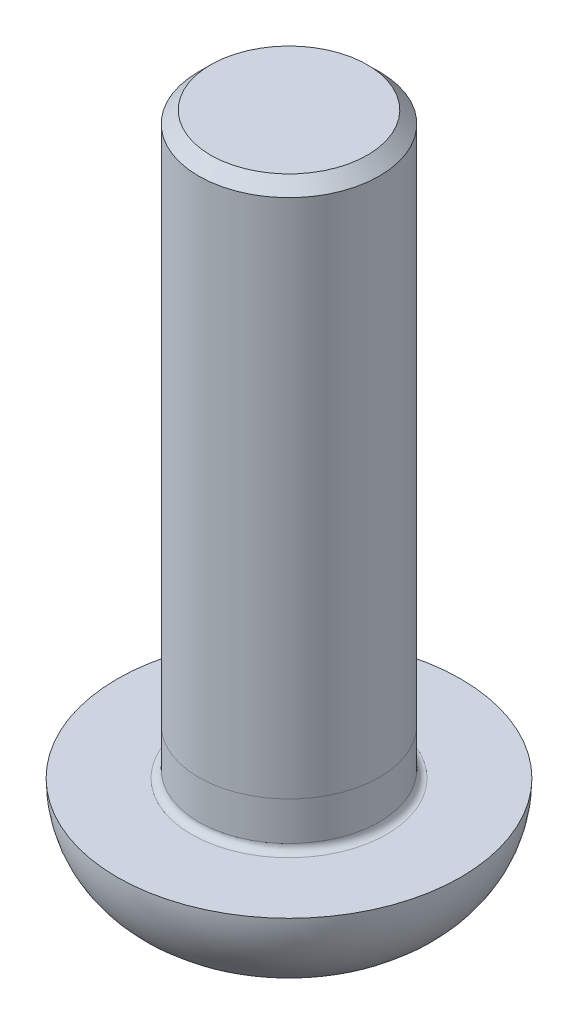
ISO-10303-21;
HEADER;
FILE_DESCRIPTION(('STEP AP214'),'2;1');
FILE_NAME('part.step','',(''),(''),'','','');
FILE_SCHEMA(('AUTOMOTIVE_DESIGN { 1 0 10303 214 1 1 1 1 }'));
ENDSEC;
DATA;
#1=APPLICATION_CONTEXT('core data for automotive mechanical design processes');
#2=APPLICATION_PROTOCOL_DEFINITION('international standard','automotive_design',2000,#1);
#3=PRODUCT_CONTEXT('',#1,'mechanical');
#4=PRODUCT('Part','Part','',(#3));
#5=PRODUCT_RELATED_PRODUCT_CATEGORY('part','',(#4));
#6=PRODUCT_DEFINITION_FORMATION('','',#4);
#7=PRODUCT_DEFINITION_CONTEXT('part definition',#1,'design');
#8=PRODUCT_DEFINITION('design','',#6,#7);
#9=PRODUCT_DEFINITION_SHAPE('','',#8);
#10=(LENGTH_UNIT() NAMED_UNIT(*) SI_UNIT(.MILLI.,.METRE.));
#11=(NAMED_UNIT(*) PLANE_ANGLE_UNIT() SI_UNIT($,.RADIAN.));
#12=(NAMED_UNIT(*) SI_UNIT($,.STERADIAN.) SOLID_ANGLE_UNIT());
#13=UNCERTAINTY_MEASURE_WITH_UNIT(LENGTH_MEASURE(1.E-05),#10,'distance_accuracy_value','');
#14=(GEOMETRIC_REPRESENTATION_CONTEXT(3) GLOBAL_UNCERTAINTY_ASSIGNED_CONTEXT((#13)) GLOBAL_UNIT_ASSIGNED_CONTEXT((#10,
#11,#12)) REPRESENTATION_CONTEXT('',''));
#15=CARTESIAN_POINT('',(0.,0.,0.));
#16=DIRECTION('',(0.,0.,1.));
#17=DIRECTION('',(1.,0.,0.));
#18=AXIS2_PLACEMENT_3D('',#15,#16,#17);
#19=CARTESIAN_POINT('',(0.,0.,0.));
#20=DIRECTION('',(0.,1.,0.));
#21=DIRECTION('',(0.,0.,1.));
#22=AXIS2_PLACEMENT_3D('',#19,#20,#21);
#23=CYLINDRICAL_SURFACE('',#22,2.5);
#24=CARTESIAN_POINT('',(0.,15.6666666666666,0.));
#25=DIRECTION('',(0.,1.,0.));
#26=DIRECTION('',(0.,0.,1.));
#27=AXIS2_PLACEMENT_3D('',#24,#25,#26);
#28=CIRCLE('',#27,2.5);
#29=CARTESIAN_POINT('',(0.,15.6666666666666,2.5));
#30=VERTEX_POINT('',#29);
#31=EDGE_CURVE('E28',#30,#30,#28,.F.);
#32=ORIENTED_EDGE('',*,*,#31,.T.);
#33=EDGE_LOOP('',(#32));
#34=FACE_BOUND('',#33,.T.);
#35=CARTESIAN_POINT('',(0.,1.26666666666666,0.));
#36=DIRECTION('',(0.,1.,0.));
#37=DIRECTION('',(0.,0.,1.));
#38=AXIS2_PLACEMENT_3D('',#35,#36,#37);
#39=CIRCLE('',#38,2.5);
#40=CARTESIAN_POINT('',(0.,1.26666666666666,2.5));
#41=VERTEX_POINT('',#40);
#42=EDGE_CURVE('E11',#41,#41,#39,.T.);
#43=ORIENTED_EDGE('',*,*,#42,.T.);
#44=EDGE_LOOP('',(#43));
#45=FACE_BOUND('',#44,.T.);
#46=ADVANCED_FACE('F18',(#34,#45),#23,.T.);
#47=ORIENTED_EDGE('',*,*,#42,.F.);
#48=EDGE_LOOP('',(#47));
#49=FACE_BOUND('',#48,.T.);
#50=CARTESIAN_POINT('',(0.,0.2,0.));
#51=DIRECTION('',(0.,1.,0.));
#52=DIRECTION('',(0.,0.,1.));
#53=AXIS2_PLACEMENT_3D('',#50,#51,#52);
#54=CIRCLE('',#53,2.5);
#55=CARTESIAN_POINT('',(0.,0.2,2.5));
#56=VERTEX_POINT('',#55);
#57=EDGE_CURVE('E280',#56,#56,#54,.T.);
#58=ORIENTED_EDGE('',*,*,#57,.T.);
#59=EDGE_LOOP('',(#58));
#60=FACE_BOUND('',#59,.T.);
#61=ADVANCED_FACE('F192',(#49,#60),#23,.T.);
#62=CARTESIAN_POINT('',(4.75,0.,0.));
#63=DIRECTION('',(0.,1.,0.));
#64=DIRECTION('',(0.,0.,1.));
#65=AXIS2_PLACEMENT_3D('',#62,#63,#64);
#66=PLANE('',#65);
#67=CARTESIAN_POINT('',(0.,0.,0.));
#68=DIRECTION('',(0.,1.,0.));
#69=DIRECTION('',(0.,0.,1.));
#70=AXIS2_PLACEMENT_3D('',#67,#68,#69);
#71=CIRCLE('',#70,2.7);
#72=CARTESIAN_POINT('',(0.,0.,2.7));
#73=VERTEX_POINT('',#72);
#74=EDGE_CURVE('E277',#73,#73,#71,.F.);
#75=ORIENTED_EDGE('',*,*,#74,.T.);
#76=EDGE_LOOP('',(#75));
#77=FACE_BOUND('',#76,.T.);
#78=CARTESIAN_POINT('',(0.,0.,0.));
#79=DIRECTION('',(0.,1.,0.));
#80=DIRECTION('',(0.,0.,1.));
#81=AXIS2_PLACEMENT_3D('',#78,#79,#80);
#82=CIRCLE('',#81,4.75);
#83=CARTESIAN_POINT('',(0.,0.,4.75));
#84=VERTEX_POINT('',#83);
#85=EDGE_CURVE('E108',#84,#84,#82,.T.);
#86=ORIENTED_EDGE('',*,*,#85,.T.);
#87=EDGE_LOOP('',(#86));
#88=FACE_BOUND('',#87,.T.);
#89=ADVANCED_FACE('F199',(#77,#88),#66,.T.);
#90=CARTESIAN_POINT('',(0.,16.,0.));
#91=DIRECTION('',(0.,1.,0.));
#92=DIRECTION('',(0.,0.,1.));
#93=AXIS2_PLACEMENT_3D('',#90,#91,#92);
#94=PLANE('',#93);
#95=CARTESIAN_POINT('',(0.,16.,0.));
#96=DIRECTION('',(0.,1.,0.));
#97=DIRECTION('',(0.,0.,1.));
#98=AXIS2_PLACEMENT_3D('',#95,#96,#97);
#99=CIRCLE('',#98,2.16666666666667);
#100=CARTESIAN_POINT('',(0.,16.,2.16666666666667));
#101=VERTEX_POINT('',#100);
#102=EDGE_CURVE('E282',#101,#101,#99,.T.);
#103=ORIENTED_EDGE('',*,*,#102,.T.);
#104=EDGE_LOOP('',(#103));
#105=FACE_BOUND('',#104,.T.);
#106=ADVANCED_FACE('F227',(#105),#94,.T.);
#107=CARTESIAN_POINT('',(0.,0.2,0.));
#108=DIRECTION('',(0.,1.,0.));
#109=DIRECTION('',(0.,0.,1.));
#110=AXIS2_PLACEMENT_3D('',#107,#108,#109);
#111=TOROIDAL_SURFACE('',#110,2.7,0.2);
#112=ORIENTED_EDGE('',*,*,#74,.F.);
#113=EDGE_LOOP('',(#112));
#114=FACE_BOUND('',#113,.T.);
#115=ORIENTED_EDGE('',*,*,#57,.F.);
#116=EDGE_LOOP('',(#115));
#117=FACE_BOUND('',#116,.T.);
#118=ADVANCED_FACE('F265',(#114,#117),#111,.F.);
#119=CARTESIAN_POINT('',(0.,16.,0.));
#120=DIRECTION('',(0.,-1.,0.));
#121=DIRECTION('',(0.,0.,-1.));
#122=AXIS2_PLACEMENT_3D('',#119,#120,#121);
#123=CONICAL_SURFACE('',#122,2.16666666666667,0.785398163397446);
#124=ORIENTED_EDGE('',*,*,#31,.F.);
#125=EDGE_LOOP('',(#124));
#126=FACE_BOUND('',#125,.T.);
#127=ORIENTED_EDGE('',*,*,#102,.F.);
#128=EDGE_LOOP('',(#127));
#129=FACE_BOUND('',#128,.T.);
#130=ADVANCED_FACE('F21',(#126,#129),#123,.T.);
#131=CARTESIAN_POINT('',(0.,0.,0.));
#132=DIRECTION('',(0.,-1.,0.));
#133=DIRECTION('',(0.,0.,-1.));
#134=AXIS2_PLACEMENT_3D('',#131,#132,#133);
#135=DEGENERATE_TOROIDAL_SURFACE('',#134,1.98223347818215,2.76776652181785,.T.);
#136=ORIENTED_EDGE('',*,*,#85,.F.);
#137=EDGE_LOOP('',(#136));
#138=FACE_BOUND('',#137,.T.);
#139=CARTESIAN_POINT('',(0.,-2.75,0.));
#140=DIRECTION('',(0.,-1.,0.));
#141=DIRECTION('',(0.,0.,-1.));
#142=AXIS2_PLACEMENT_3D('',#139,#140,#141);
#143=CIRCLE('',#142,2.29533333333334);
#144=CARTESIAN_POINT('',(0.,-2.75,-2.29533333333334));
#145=VERTEX_POINT('',#144);
#146=EDGE_CURVE('E119',#145,#145,#143,.T.);
#147=ORIENTED_EDGE('',*,*,#146,.F.);
#148=EDGE_LOOP('',(#147));
#149=FACE_BOUND('',#148,.T.);
#150=ADVANCED_FACE('F143',(#138,#149),#135,.T.);
#151=CARTESIAN_POINT('',(0.,0.0925836230047557,0.));
#152=DIRECTION('',(0.,-1.,0.));
#153=DIRECTION('',(0.,0.,-1.));
#154=AXIS2_PLACEMENT_3D('',#151,#152,#153);
#155=CONICAL_SURFACE('',#154,0.,1.0471975511966);
#156=CARTESIAN_POINT('',(0.,0.0925836230047561,0.));
#157=VERTEX_POINT('',#156);
#158=VERTEX_LOOP('',#157);
#159=FACE_BOUND('',#158,.T.);
#160=CARTESIAN_POINT('',(-0.865909933730604,-0.907483050328135,1.5002));
#161=CARTESIAN_POINT('',(-0.903968454193449,-0.885499233548862,1.43428070889745));
#162=CARTESIAN_POINT('',(-0.942355490953076,-0.865505266461506,1.36779241087776));
#163=CARTESIAN_POINT('',(-1.01979436916422,-0.83060447796419,1.23366433933493));
#164=CARTESIAN_POINT('',(-1.05884758728359,-0.815710005102851,1.16602218135311));
#165=CARTESIAN_POINT('',(-1.13646999803242,-0.792523058089927,1.03157622213015));
#166=CARTESIAN_POINT('',(-1.17502724286933,-0.784076288491498,0.96479311507275));
#167=CARTESIAN_POINT('',(-1.25232329150577,-0.773989954291537,0.830912431610116));
#168=CARTESIAN_POINT('',(-1.29106181408334,-0.772342040137576,0.763815342295617));
#169=CARTESIAN_POINT('',(-1.36345580713301,-0.775757999832789,0.638425268170801));
#170=CARTESIAN_POINT('',(-1.39712207785429,-0.779983136003665,0.580113576780177));
#171=CARTESIAN_POINT('',(-1.46423526865157,-0.793378152212355,0.463870120461215));
#172=CARTESIAN_POINT('',(-1.49768195634506,-0.802552614395532,0.405938758031212));
#173=CARTESIAN_POINT('',(-1.56493368410116,-0.825489560734679,0.289455348660847));
#174=CARTESIAN_POINT('',(-1.59873020609217,-0.83934933894113,0.230918055453307));
#175=CARTESIAN_POINT('',(-1.6658189879754,-0.870806161016339,0.11471687661364));
#176=CARTESIAN_POINT('',(-1.699112108342,-0.888395806669299,0.0570515005961896));
#177=CARTESIAN_POINT('',(-1.73216627762271,-0.907483050328134,-0.000199999999999938));
#178=B_SPLINE_CURVE_WITH_KNOTS('',3,(#160,#161,#162,#163,#164,#165,#166,#167,#168,#169,#170,
#171,#172,#173,#174,#175,#176,#177),.UNSPECIFIED.,.F.,.F.,(4,2,2,2,2,2,2,2,4),(0.,
0.237777822177384,0.476127422841921,0.708577067230593,0.940741159251584,1.14294352835891,
1.34533342091876,1.55221450553907,1.75868901573748),.UNSPECIFIED.);
#179=CARTESIAN_POINT('',(-0.866025403784442,-0.907416376995246,1.5));
#180=VERTEX_POINT('',#179);
#181=CARTESIAN_POINT('',(-1.73205080756887,-0.907416376995245,0.));
#182=VERTEX_POINT('',#181);
#183=EDGE_CURVE('E231',#180,#182,#178,.T.);
#184=ORIENTED_EDGE('',*,*,#183,.T.);
#185=CARTESIAN_POINT('',(-1.73216627762271,-0.907483050328134,0.000199999999999923));
#186=CARTESIAN_POINT('',(-1.69410775715987,-0.88549923354886,-0.065719291102547));
#187=CARTESIAN_POINT('',(-1.65572072040024,-0.865505266461504,-0.132207589122234));
#188=CARTESIAN_POINT('',(-1.5782818421891,-0.830604477964188,-0.266335660665069));
#189=CARTESIAN_POINT('',(-1.53922862406973,-0.815710005102848,-0.333977818646885));
#190=CARTESIAN_POINT('',(-1.4616062133209,-0.792523058089924,-0.468423777869842));
#191=CARTESIAN_POINT('',(-1.42304896848399,-0.784076288491495,-0.535206884927247));
#192=CARTESIAN_POINT('',(-1.34575291984755,-0.773989954291535,-0.66908756838988));
#193=CARTESIAN_POINT('',(-1.30701439726998,-0.772342040137574,-0.736184657704378));
#194=CARTESIAN_POINT('',(-1.23462040422031,-0.775757999832787,-0.861574731829195));
#195=CARTESIAN_POINT('',(-1.20095413349903,-0.779983136003662,-0.919886423219819));
#196=CARTESIAN_POINT('',(-1.13384094270174,-0.793378152212352,-1.03612987953878));
#197=CARTESIAN_POINT('',(-1.10039425500826,-0.80255261439553,-1.09406124196879));
#198=CARTESIAN_POINT('',(-1.03314252725215,-0.825489560734676,-1.21054465133915));
#199=CARTESIAN_POINT('',(-0.999346005261149,-0.839349338941127,-1.26908194454669));
#200=CARTESIAN_POINT('',(-0.932257223377915,-0.870806161016338,-1.38528312338636));
#201=CARTESIAN_POINT('',(-0.898964103011319,-0.888395806669298,-1.44294849940381));
#202=CARTESIAN_POINT('',(-0.865909933730599,-0.907483050328135,-1.5002));
#203=B_SPLINE_CURVE_WITH_KNOTS('',3,(#185,#186,#187,#188,#189,#190,#191,#192,#193,#194,#195,
#196,#197,#198,#199,#200,#201,#202),.UNSPECIFIED.,.F.,.F.,(4,2,2,2,2,2,2,2,4),(0.,
0.237777822177384,0.476127422841919,0.70857706723059,0.940741159251581,1.14294352835891,
1.34533342091876,1.55221450553907,1.75868901573748),.UNSPECIFIED.);
#204=CARTESIAN_POINT('',(-0.866025403784436,-0.907416376995246,-1.5));
#205=VERTEX_POINT('',#204);
#206=EDGE_CURVE('E210',#182,#205,#203,.T.);
#207=ORIENTED_EDGE('',*,*,#206,.T.);
#208=CARTESIAN_POINT('',(-3.02145642388414,-1.85499597925637,-1.5));
#209=CARTESIAN_POINT('',(-2.95131363222548,-1.81872634413046,-1.5));
#210=CARTESIAN_POINT('',(-2.88107133565645,-1.78264804643317,-1.5));
#211=CARTESIAN_POINT('',(-2.74034345018755,-1.71096639873344,-1.5));
#212=CARTESIAN_POINT('',(-2.66985785718801,-1.67536305678391,-1.5));
#213=CARTESIAN_POINT('',(-2.45775199033708,-1.56929505571651,-1.5));
#214=CARTESIAN_POINT('',(-2.31570212462528,-1.49968664419272,-1.5));
#215=CARTESIAN_POINT('',(-2.0222700931377,-1.36025010782342,-1.5));
#216=CARTESIAN_POINT('',(-1.87079658899418,-1.29061113184475,-1.5));
#217=CARTESIAN_POINT('',(-1.64154653334164,-1.19092613711938,-1.5));
#218=CARTESIAN_POINT('',(-1.56480867695362,-1.15850064529067,-1.5));
#219=CARTESIAN_POINT('',(-1.41048071876465,-1.09575464897766,-1.5));
#220=CARTESIAN_POINT('',(-1.33289069925537,-1.06543394327289,-1.5));
#221=CARTESIAN_POINT('',(-1.16506923685472,-1.00326385892879,-1.5));
#222=CARTESIAN_POINT('',(-1.07467184506323,-0.971856304712149,-1.5));
#223=CARTESIAN_POINT('',(-0.892286344288553,-0.914121423485026,-1.5));
#224=CARTESIAN_POINT('',(-0.800299039468324,-0.887791605663107,-1.5));
#225=CARTESIAN_POINT('',(-0.616384962739645,-0.842503687233488,-1.5));
#226=CARTESIAN_POINT('',(-0.524492112475494,-0.823411627465088,-1.5));
#227=CARTESIAN_POINT('',(-0.339332787815074,-0.793844811415096,-1.5));
#228=CARTESIAN_POINT('',(-0.246067166383446,-0.783364916483212,-1.5));
#229=CARTESIAN_POINT('',(-0.0575309294622103,-0.772365176381842,-1.5));
#230=CARTESIAN_POINT('',(0.0377489009569059,-0.771995442319628,-1.5));
#231=CARTESIAN_POINT('',(0.227780550171567,-0.781659314746172,-1.5));
#232=CARTESIAN_POINT('',(0.322532205107233,-0.791695986775011,-1.5));
#233=CARTESIAN_POINT('',(0.512543387261529,-0.821037981256058,-1.5));
#234=CARTESIAN_POINT('',(0.60777273050509,-0.840531114897656,-1.5));
#235=CARTESIAN_POINT('',(0.796454627035134,-0.886704530221089,-1.5));
#236=CARTESIAN_POINT('',(0.889906503309468,-0.913387493957522,-1.5));
#237=CARTESIAN_POINT('',(1.07404515505715,-0.971638917632286,-1.5));
#238=CARTESIAN_POINT('',(1.16475145498871,-1.00314689099956,-1.5));
#239=CARTESIAN_POINT('',(1.34480972609266,-1.06984863548089,-1.49999999999999));
#240=CARTESIAN_POINT('',(1.43416131246012,-1.10504343218365,-1.49999999999999));
#241=CARTESIAN_POINT('',(1.61186009121394,-1.17813872958031,-1.5));
#242=CARTESIAN_POINT('',(1.70020602613332,-1.21604226107406,-1.49999999999999));
#243=CARTESIAN_POINT('',(1.87602988508462,-1.29381450595419,-1.49999999999999));
#244=CARTESIAN_POINT('',(1.96350775752119,-1.33368333532212,-1.49999999999999));
#245=CARTESIAN_POINT('',(2.1326218487944,-1.41248972462724,-1.49999999999999));
#246=CARTESIAN_POINT('',(2.21429755819774,-1.45134289392663,-1.49999999999999));
#247=CARTESIAN_POINT('',(2.37716279390999,-1.53006046378019,-1.49999999999999));
#248=CARTESIAN_POINT('',(2.4583523024031,-1.56992490111324,-1.49999999999999));
#249=CARTESIAN_POINT('',(2.62004632732072,-1.6503022330724,-1.49999999999999));
#250=CARTESIAN_POINT('',(2.70055225558183,-1.69081229420091,-1.49999999999999));
#251=CARTESIAN_POINT('',(2.86123337707426,-1.77246576421029,-1.49999999999999));
#252=CARTESIAN_POINT('',(2.94140859951954,-1.81360911555932,-1.49999999999999));
#253=CARTESIAN_POINT('',(3.02145642388415,-1.85499597925637,-1.5));
#254=B_SPLINE_CURVE_WITH_KNOTS('',3,(#208,#209,#210,#211,#212,#213,#214,#215,#216,#217,#218,
#219,#220,#221,#222,#223,#224,#225,#226,#227,#228,#229,#230,#231,#232,#233,#234,#235,#236,#237,
#238,#239,#240,#241,#242,#243,#244,#245,#246,#247,#248,#249,#250,#251,#252,#253),.UNSPECIFIED.,
.F.,.F.,(4,2,2,2,2,2,2,2,2,2,2,2,2,2,2,2,2,2,2,2,2,2,4),(0.,0.236895851279357,0.473795714055903,
0.948337668306544,1.44837680374914,1.69827558933975,1.94815045126331,2.23513816543362,
2.52198474176536,2.80322774532891,3.08430281656004,3.36954893314226,3.6548791019808,
3.94612368672111,4.23747706650592,4.52543887437366,4.81348100032893,5.10185062065299,
5.39023727945614,5.66156699087906,5.93290658449597,6.20327446222167,6.47361792142006),.UNSPECIFIED.);
#255=CARTESIAN_POINT('',(0.866025403784441,-0.907416376995245,-1.5));
#256=VERTEX_POINT('',#255);
#257=EDGE_CURVE('E106',#205,#256,#254,.T.);
#258=ORIENTED_EDGE('',*,*,#257,.T.);
#259=CARTESIAN_POINT('',(0.865909933730603,-0.907483050328134,-1.5002));
#260=CARTESIAN_POINT('',(0.903968454193449,-0.885499233548861,-1.43428070889745));
#261=CARTESIAN_POINT('',(0.942355490953075,-0.865505266461506,-1.36779241087777));
#262=CARTESIAN_POINT('',(1.01979436916422,-0.83060447796419,-1.23366433933493));
#263=CARTESIAN_POINT('',(1.05884758728358,-0.81571000510285,-1.16602218135311));
#264=CARTESIAN_POINT('',(1.13646999803242,-0.792523058089926,-1.03157622213016));
#265=CARTESIAN_POINT('',(1.17502724286933,-0.784076288491498,-0.964793115072752));
#266=CARTESIAN_POINT('',(1.25232329150577,-0.773989954291536,-0.830912431610118));
#267=CARTESIAN_POINT('',(1.29106181408333,-0.772342040137575,-0.763815342295619));
#268=CARTESIAN_POINT('',(1.363455807133,-0.775757999832788,-0.638425268170802));
#269=CARTESIAN_POINT('',(1.39712207785429,-0.779983136003664,-0.580113576780179));
#270=CARTESIAN_POINT('',(1.46423526865157,-0.793378152212355,-0.463870120461217));
#271=CARTESIAN_POINT('',(1.49768195634506,-0.802552614395532,-0.405938758031213));
#272=CARTESIAN_POINT('',(1.56493368410116,-0.825489560734679,-0.289455348660847));
#273=CARTESIAN_POINT('',(1.59873020609217,-0.83934933894113,-0.230918055453307));
#274=CARTESIAN_POINT('',(1.6658189879754,-0.87080616101634,-0.114716876613639));
#275=CARTESIAN_POINT('',(1.699112108342,-0.888395806669299,-0.0570515005961878));
#276=CARTESIAN_POINT('',(1.73216627762271,-0.907483050328134,0.000200000000002892));
#277=B_SPLINE_CURVE_WITH_KNOTS('',3,(#259,#260,#261,#262,#263,#264,#265,#266,#267,#268,#269,
#270,#271,#272,#273,#274,#275,#276),.UNSPECIFIED.,.F.,.F.,(4,2,2,2,2,2,2,2,4),(0.,
0.237777822177384,0.476127422841919,0.708577067230591,0.940741159251581,1.14294352835891,
1.34533342091876,1.55221450553907,1.75868901573748),.UNSPECIFIED.);
#278=CARTESIAN_POINT('',(1.73205080756887,-0.907416376995245,0.));
#279=VERTEX_POINT('',#278);
#280=EDGE_CURVE('E255',#256,#279,#277,.T.);
#281=ORIENTED_EDGE('',*,*,#280,.T.);
#282=CARTESIAN_POINT('',(1.73216627762271,-0.907483050328135,-0.000199999999997108));
#283=CARTESIAN_POINT('',(1.69410775715987,-0.885499233548861,0.0657192911025496));
#284=CARTESIAN_POINT('',(1.65572072040024,-0.865505266461505,0.132207589122237));
#285=CARTESIAN_POINT('',(1.5782818421891,-0.830604477964188,0.266335660665072));
#286=CARTESIAN_POINT('',(1.53922862406973,-0.815710005102849,0.333977818646888));
#287=CARTESIAN_POINT('',(1.4616062133209,-0.792523058089925,0.468423777869845));
#288=CARTESIAN_POINT('',(1.42304896848399,-0.784076288491496,0.53520688492725));
#289=CARTESIAN_POINT('',(1.34575291984754,-0.773989954291535,0.669087568389883));
#290=CARTESIAN_POINT('',(1.30701439726998,-0.772342040137575,0.736184657704381));
#291=CARTESIAN_POINT('',(1.23462040422031,-0.775757999832788,0.861574731829198));
#292=CARTESIAN_POINT('',(1.20095413349903,-0.779983136003663,0.919886423219822));
#293=CARTESIAN_POINT('',(1.13384094270174,-0.793378152212353,1.03612987953879));
#294=CARTESIAN_POINT('',(1.10039425500826,-0.802552614395531,1.09406124196879));
#295=CARTESIAN_POINT('',(1.03314252725215,-0.825489560734677,1.21054465133915));
#296=CARTESIAN_POINT('',(0.999346005261148,-0.839349338941129,1.26908194454669));
#297=CARTESIAN_POINT('',(0.932257223377913,-0.870806161016339,1.38528312338636));
#298=CARTESIAN_POINT('',(0.898964103011317,-0.888395806669299,1.44294849940381));
#299=CARTESIAN_POINT('',(0.865909933730595,-0.907483050328135,1.5002));
#300=B_SPLINE_CURVE_WITH_KNOTS('',3,(#282,#283,#284,#285,#286,#287,#288,#289,#290,#291,#292,
#293,#294,#295,#296,#297,#298,#299),.UNSPECIFIED.,.F.,.F.,(4,2,2,2,2,2,2,2,4),(0.,
0.237777822177384,0.47612742284192,0.708577067230591,0.940741159251582,1.14294352835891,
1.34533342091876,1.55221450553907,1.75868901573748),.UNSPECIFIED.);
#301=CARTESIAN_POINT('',(0.866025403784433,-0.907416376995246,1.5));
#302=VERTEX_POINT('',#301);
#303=EDGE_CURVE('E249',#279,#302,#300,.T.);
#304=ORIENTED_EDGE('',*,*,#303,.T.);
#305=CARTESIAN_POINT('',(3.02145642388414,-1.85499597925636,1.5));
#306=CARTESIAN_POINT('',(2.95131363222547,-1.81872634413045,1.5));
#307=CARTESIAN_POINT('',(2.88107133565644,-1.78264804643317,1.5));
#308=CARTESIAN_POINT('',(2.74034345018755,-1.71096639873344,1.50000000000001));
#309=CARTESIAN_POINT('',(2.66985785718801,-1.67536305678391,1.5));
#310=CARTESIAN_POINT('',(2.45775199033708,-1.56929505571651,1.5));
#311=CARTESIAN_POINT('',(2.31570212462528,-1.49968664419272,1.5));
#312=CARTESIAN_POINT('',(2.0222700931377,-1.36025010782342,1.5));
#313=CARTESIAN_POINT('',(1.87079658899418,-1.29061113184475,1.5));
#314=CARTESIAN_POINT('',(1.64154653334163,-1.19092613711938,1.5));
#315=CARTESIAN_POINT('',(1.56480867695361,-1.15850064529067,1.5));
#316=CARTESIAN_POINT('',(1.41048071876465,-1.09575464897766,1.5));
#317=CARTESIAN_POINT('',(1.33289069925537,-1.06543394327289,1.5));
#318=CARTESIAN_POINT('',(1.16506923685471,-1.00326385892879,1.5));
#319=CARTESIAN_POINT('',(1.07467184506323,-0.971856304712148,1.5));
#320=CARTESIAN_POINT('',(0.892286344288548,-0.914121423485025,1.5));
#321=CARTESIAN_POINT('',(0.800299039468318,-0.887791605663106,1.5));
#322=CARTESIAN_POINT('',(0.616384962739639,-0.842503687233487,1.5));
#323=CARTESIAN_POINT('',(0.524492112475487,-0.823411627465087,1.5));
#324=CARTESIAN_POINT('',(0.339332787815066,-0.793844811415096,1.5));
#325=CARTESIAN_POINT('',(0.246067166383438,-0.783364916483213,1.5));
#326=CARTESIAN_POINT('',(0.0575309294622016,-0.772365176381843,1.5));
#327=CARTESIAN_POINT('',(-0.0377489009569148,-0.771995442319629,1.5));
#328=CARTESIAN_POINT('',(-0.227780550171576,-0.781659314746173,1.5));
#329=CARTESIAN_POINT('',(-0.322532205107242,-0.791695986775013,1.5));
#330=CARTESIAN_POINT('',(-0.512543387261538,-0.82103798125606,1.5));
#331=CARTESIAN_POINT('',(-0.607772730505099,-0.840531114897658,1.5));
#332=CARTESIAN_POINT('',(-0.796454627035143,-0.886704530221092,1.5));
#333=CARTESIAN_POINT('',(-0.889906503309477,-0.913387493957526,1.5));
#334=CARTESIAN_POINT('',(-1.07404515505716,-0.97163891763229,1.5));
#335=CARTESIAN_POINT('',(-1.16475145498872,-1.00314689099957,1.5));
#336=CARTESIAN_POINT('',(-1.34480972609267,-1.0698486354809,1.49999999999999));
#337=CARTESIAN_POINT('',(-1.43416131246013,-1.10504343218365,1.49999999999999));
#338=CARTESIAN_POINT('',(-1.61186009121394,-1.17813872958031,1.49999999999999));
#339=CARTESIAN_POINT('',(-1.70020602613333,-1.21604226107406,1.49999999999999));
#340=CARTESIAN_POINT('',(-1.87602988508462,-1.29381450595419,1.49999999999999));
#341=CARTESIAN_POINT('',(-1.96350775752119,-1.33368333532212,1.49999999999999));
#342=CARTESIAN_POINT('',(-2.1326218487944,-1.41248972462725,1.49999999999999));
#343=CARTESIAN_POINT('',(-2.21429755819775,-1.45134289392663,1.49999999999999));
#344=CARTESIAN_POINT('',(-2.37716279390999,-1.53006046378019,1.49999999999999));
#345=CARTESIAN_POINT('',(-2.45835230240311,-1.56992490111324,1.49999999999999));
#346=CARTESIAN_POINT('',(-2.62004632732073,-1.6503022330724,1.49999999999999));
#347=CARTESIAN_POINT('',(-2.70055225558183,-1.69081229420091,1.49999999999999));
#348=CARTESIAN_POINT('',(-2.86123337707426,-1.77246576421029,1.49999999999999));
#349=CARTESIAN_POINT('',(-2.94140859951954,-1.81360911555932,1.49999999999999));
#350=CARTESIAN_POINT('',(-3.02145642388415,-1.85499597925637,1.5));
#351=B_SPLINE_CURVE_WITH_KNOTS('',3,(#305,#306,#307,#308,#309,#310,#311,#312,#313,#314,#315,
#316,#317,#318,#319,#320,#321,#322,#323,#324,#325,#326,#327,#328,#329,#330,#331,#332,#333,#334,
#335,#336,#337,#338,#339,#340,#341,#342,#343,#344,#345,#346,#347,#348,#349,#350),.UNSPECIFIED.,
.F.,.F.,(4,2,2,2,2,2,2,2,2,2,2,2,2,2,2,2,2,2,2,2,2,2,4),(0.,0.236895851279357,0.473795714055902,
0.948337668306543,1.44837680374914,1.69827558933975,1.9481504512633,2.23513816543362,
2.52198474176536,2.80322774532891,3.08430281656004,3.36954893314226,3.65487910198081,
3.94612368672112,4.23747706650592,4.52543887437366,4.81348100032894,5.10185062065299,
5.39023727945614,5.66156699087906,5.93290658449597,6.20327446222167,6.47361792142005),.UNSPECIFIED.);
#352=EDGE_CURVE('E241',#302,#180,#351,.T.);
#353=ORIENTED_EDGE('',*,*,#352,.T.);
#354=EDGE_LOOP('',(#184,#207,#258,#281,#304,#353));
#355=FACE_BOUND('',#354,.T.);
#356=ADVANCED_FACE('F176',(#159,#355),#155,.F.);
#357=CARTESIAN_POINT('',(-0.866025403784436,20.3164800088787,-1.5));
#358=DIRECTION('',(0.,0.,-1.));
#359=DIRECTION('',(-1.,0.,0.));
#360=AXIS2_PLACEMENT_3D('',#357,#358,#359);
#361=PLANE('',#360);
#362=CARTESIAN_POINT('',(2.65937634812055,-3.10401193097591,-1.5));
#363=CARTESIAN_POINT('',(2.53120070134799,-3.07413909502058,-1.5));
#364=CARTESIAN_POINT('',(2.40292071870203,-3.04468564852783,-1.49999999999999));
#365=CARTESIAN_POINT('',(2.14601955318443,-2.98719716387202,-1.49999999999999));
#366=CARTESIAN_POINT('',(2.01739831165161,-2.95916238877961,-1.49999999999999));
#367=CARTESIAN_POINT('',(1.75847591988681,-2.90483936544629,-1.49999999999999));
#368=CARTESIAN_POINT('',(1.62817060047403,-2.87857076333201,-1.49999999999999));
#369=CARTESIAN_POINT('',(1.36695300909498,-2.82911460443209,-1.5));
#370=CARTESIAN_POINT('',(1.23604067890611,-2.80592734980241,-1.5));
#371=CARTESIAN_POINT('',(0.977065471474464,-2.76477846002447,-1.5));
#372=CARTESIAN_POINT('',(0.849023202739873,-2.7466906865682,-1.5));
#373=CARTESIAN_POINT('',(0.592203499828399,-2.71690340601873,-1.5));
#374=CARTESIAN_POINT('',(0.463426316269502,-2.70520183895392,-1.5));
#375=CARTESIAN_POINT('',(0.20594347164001,-2.69020879672858,-1.5));
#376=CARTESIAN_POINT('',(0.077240188337309,-2.68687901840123,-1.5));
#377=CARTESIAN_POINT('',(-0.180089422710527,-2.6892375826211,-1.5));
#378=CARTESIAN_POINT('',(-0.308715744435466,-2.69492655670592,-1.5));
#379=CARTESIAN_POINT('',(-0.52986217584146,-2.71148432076775,-1.5));
#380=CARTESIAN_POINT('',(-0.622533465229346,-2.72048633332363,-1.5));
#381=CARTESIAN_POINT('',(-0.807485262938245,-2.74181141198927,-1.5));
#382=CARTESIAN_POINT('',(-0.899765780755238,-2.75413439692156,-1.5));
#383=CARTESIAN_POINT('',(-1.08424538413356,-2.78139706878037,-1.5));
#384=CARTESIAN_POINT('',(-1.17644317918339,-2.79634531829033,-1.5));
#385=CARTESIAN_POINT('',(-1.36050255987262,-2.82819152553301,-1.5));
#386=CARTESIAN_POINT('',(-1.45236412781592,-2.84508958440688,-1.5));
#387=CARTESIAN_POINT('',(-1.6377417836235,-2.88071781309414,-1.5));
#388=CARTESIAN_POINT('',(-1.73125183358107,-2.89947914270706,-1.5));
#389=CARTESIAN_POINT('',(-1.91803588743793,-2.93814151346181,-1.5));
#390=CARTESIAN_POINT('',(-2.01130988841312,-2.95804256865073,-1.5));
#391=CARTESIAN_POINT('',(-2.19713640726997,-2.99858811536818,-1.5));
#392=CARTESIAN_POINT('',(-2.28969000021665,-3.01922770319159,-1.5));
#393=CARTESIAN_POINT('',(-2.47464021817384,-3.06116924213638,-1.5));
#394=CARTESIAN_POINT('',(-2.5670368539972,-3.08247114550248,-1.5));
#395=CARTESIAN_POINT('',(-2.65937634812055,-3.1040119309759,-1.5));
#396=B_SPLINE_CURVE_WITH_KNOTS('',3,(#362,#363,#364,#365,#366,#367,#368,#369,#370,#371,#372,
#373,#374,#375,#376,#377,#378,#379,#380,#381,#382,#383,#384,#385,#386,#387,#388,#389,#390,#391,
#392,#393,#394,#395),.UNSPECIFIED.,.F.,.F.,(4,2,2,2,2,2,2,2,2,2,2,2,2,2,2,2,4),(0.,
0.3948412440674,0.789755439028269,1.18851185394861,1.58730734198952,1.97513907001565,
2.36284562274863,2.74877505980209,3.13473152273522,3.41398847940781,3.69323861057504,
3.97341705977716,4.25361004902523,4.53972148341107,4.82583644487873,5.1103147938328,
5.39477267824766),.UNSPECIFIED.);
#397=CARTESIAN_POINT('',(0.866025403784437,-2.75,-1.5));
#398=VERTEX_POINT('',#397);
#399=CARTESIAN_POINT('',(-0.866025403784437,-2.75,-1.5));
#400=VERTEX_POINT('',#399);
#401=EDGE_CURVE('E87',#398,#400,#396,.T.);
#402=ORIENTED_EDGE('',*,*,#401,.F.);
#403=DIRECTION('',(0.,-1.,0.));
#404=VECTOR('',#403,1.);
#405=CARTESIAN_POINT('',(0.866025403784441,20.3164800088787,-1.5));
#406=LINE('',#405,#404);
#407=EDGE_CURVE('E109',#256,#398,#406,.T.);
#408=ORIENTED_EDGE('',*,*,#407,.F.);
#409=ORIENTED_EDGE('',*,*,#257,.F.);
#410=DIRECTION('',(0.,-1.,0.));
#411=VECTOR('',#410,1.);
#412=CARTESIAN_POINT('',(-0.866025403784436,20.3164800088787,-1.5));
#413=LINE('',#412,#411);
#414=EDGE_CURVE('E99',#205,#400,#413,.T.);
#415=ORIENTED_EDGE('',*,*,#414,.T.);
#416=EDGE_LOOP('',(#402,#408,#409,#415));
#417=FACE_BOUND('',#416,.T.);
#418=ADVANCED_FACE('F104',(#417),#361,.F.);
#419=CARTESIAN_POINT('',(0.866025403784441,20.3164800088787,-1.5));
#420=DIRECTION('',(0.866025403784439,0.,-0.5));
#421=DIRECTION('',(-0.5,0.,-0.86602540378444));
#422=AXIS2_PLACEMENT_3D('',#419,#420,#421);
#423=PLANE('',#422);
#424=CARTESIAN_POINT('',(1.73216627762271,-2.75003094320149,0.000200000000002819));
#425=CARTESIAN_POINT('',(1.69619286442473,-2.7403863264284,-0.0621077793805768));
#426=CARTESIAN_POINT('',(1.66015421271208,-2.73163049597191,-0.124528555183177));
#427=CARTESIAN_POINT('',(1.58794959362277,-2.71624719001393,-0.249590623987013));
#428=CARTESIAN_POINT('',(1.55178358051624,-2.7096205796363,-0.31223199619472));
#429=CARTESIAN_POINT('',(1.47954358942114,-2.69888268944898,-0.437355331109757));
#430=CARTESIAN_POINT('',(1.44347010027403,-2.69475860000457,-0.499836447118838));
#431=CARTESIAN_POINT('',(1.37127710246616,-2.68922860518077,-0.624878387272778));
#432=CARTESIAN_POINT('',(1.33515760407141,-2.68782217350893,-0.687439193636389));
#433=CARTESIAN_POINT('',(1.26291860728191,-2.68782217350893,-0.81256080636361));
#434=CARTESIAN_POINT('',(1.22679910888716,-2.68922860518077,-0.87512161272722));
#435=CARTESIAN_POINT('',(1.15460611107929,-2.69475860000457,-1.00016355288116));
#436=CARTESIAN_POINT('',(1.11853262193218,-2.69888268944898,-1.06264466889024));
#437=CARTESIAN_POINT('',(1.04629263083708,-2.7096205796363,-1.18776800380528));
#438=CARTESIAN_POINT('',(1.01012661773055,-2.71624719001393,-1.25040937601299));
#439=CARTESIAN_POINT('',(0.937921998641244,-2.73163049597191,-1.37547144481682));
#440=CARTESIAN_POINT('',(0.901883346928588,-2.7403863264284,-1.43789222061942));
#441=CARTESIAN_POINT('',(0.865909933730603,-2.75003094320149,-1.5002));
#442=B_SPLINE_CURVE_WITH_KNOTS('',3,(#424,#425,#426,#427,#428,#429,#430,#431,#432,#433,#434,
#435,#436,#437,#438,#439,#440,#441),.UNSPECIFIED.,.F.,.F.,(4,2,2,2,2,2,2,2,4),(0.,
0.217782584290281,0.435653544301783,0.652399669875338,0.869103816917188,1.08580796395904,
1.30255408953259,1.52042504954409,1.73820763383438),.UNSPECIFIED.);
#443=CARTESIAN_POINT('',(1.73205080756888,-2.75,0.));
#444=VERTEX_POINT('',#443);
#445=EDGE_CURVE('E94',#444,#398,#442,.T.);
#446=ORIENTED_EDGE('',*,*,#445,.F.);
#447=DIRECTION('',(0.,-1.,0.));
#448=VECTOR('',#447,1.);
#449=CARTESIAN_POINT('',(1.73205080756887,20.3164800088787,0.));
#450=LINE('',#449,#448);
#451=EDGE_CURVE('E313',#279,#444,#450,.T.);
#452=ORIENTED_EDGE('',*,*,#451,.F.);
#453=ORIENTED_EDGE('',*,*,#280,.F.);
#454=ORIENTED_EDGE('',*,*,#407,.T.);
#455=EDGE_LOOP('',(#446,#452,#453,#454));
#456=FACE_BOUND('',#455,.T.);
#457=ADVANCED_FACE('F175',(#456),#423,.F.);
#458=CARTESIAN_POINT('',(1.73205080756887,20.3164800088787,0.));
#459=DIRECTION('',(0.866025403784437,0.,0.5));
#460=DIRECTION('',(0.5,0.,-0.866025403784437));
#461=AXIS2_PLACEMENT_3D('',#458,#459,#460);
#462=PLANE('',#461);
#463=CARTESIAN_POINT('',(0.865909933730595,-2.75003094320149,1.5002));
#464=CARTESIAN_POINT('',(0.901883346928581,-2.7403863264284,1.43789222061942));
#465=CARTESIAN_POINT('',(0.937921998641238,-2.73163049597191,1.37547144481682));
#466=CARTESIAN_POINT('',(1.01012661773055,-2.71624719001393,1.25040937601299));
#467=CARTESIAN_POINT('',(1.04629263083707,-2.7096205796363,1.18776800380528));
#468=CARTESIAN_POINT('',(1.11853262193217,-2.69888268944898,1.06264466889024));
#469=CARTESIAN_POINT('',(1.15460611107928,-2.69475860000457,1.00016355288116));
#470=CARTESIAN_POINT('',(1.22679910888715,-2.68922860518077,0.875121612727223));
#471=CARTESIAN_POINT('',(1.2629186072819,-2.68782217350893,0.812560806363612));
#472=CARTESIAN_POINT('',(1.33515760407141,-2.68782217350893,0.687439193636391));
#473=CARTESIAN_POINT('',(1.37127710246616,-2.68922860518077,0.624878387272781));
#474=CARTESIAN_POINT('',(1.44347010027403,-2.69475860000457,0.499836447118841));
#475=CARTESIAN_POINT('',(1.47954358942114,-2.69888268944898,0.43735533110976));
#476=CARTESIAN_POINT('',(1.55178358051624,-2.7096205796363,0.312231996194723));
#477=CARTESIAN_POINT('',(1.58794959362277,-2.71624719001393,0.249590623987016));
#478=CARTESIAN_POINT('',(1.66015421271207,-2.73163049597191,0.12452855518318));
#479=CARTESIAN_POINT('',(1.69619286442473,-2.7403863264284,0.0621077793805806));
#480=CARTESIAN_POINT('',(1.73216627762271,-2.75003094320149,-0.000199999999997121));
#481=B_SPLINE_CURVE_WITH_KNOTS('',3,(#463,#464,#465,#466,#467,#468,#469,#470,#471,#472,#473,
#474,#475,#476,#477,#478,#479,#480),.UNSPECIFIED.,.F.,.F.,(4,2,2,2,2,2,2,2,4),(0.,
0.217782584290281,0.435653544301783,0.652399669875338,0.869103816917188,1.08580796395904,
1.30255408953259,1.52042504954409,1.73820763383438),.UNSPECIFIED.);
#482=CARTESIAN_POINT('',(0.86602540378444,-2.75,1.5));
#483=VERTEX_POINT('',#482);
#484=EDGE_CURVE('E128',#483,#444,#481,.T.);
#485=ORIENTED_EDGE('',*,*,#484,.F.);
#486=DIRECTION('',(0.,-1.,0.));
#487=VECTOR('',#486,1.);
#488=CARTESIAN_POINT('',(0.866025403784433,20.3164800088787,1.5));
#489=LINE('',#488,#487);
#490=EDGE_CURVE('E310',#302,#483,#489,.T.);
#491=ORIENTED_EDGE('',*,*,#490,.F.);
#492=ORIENTED_EDGE('',*,*,#303,.F.);
#493=ORIENTED_EDGE('',*,*,#451,.T.);
#494=EDGE_LOOP('',(#485,#491,#492,#493));
#495=FACE_BOUND('',#494,.T.);
#496=ADVANCED_FACE('F179',(#495),#462,.F.);
#497=CARTESIAN_POINT('',(0.866025403784433,20.3164800088787,1.5));
#498=DIRECTION('',(0.,0.,1.));
#499=DIRECTION('',(1.,0.,0.));
#500=AXIS2_PLACEMENT_3D('',#497,#498,#499);
#501=PLANE('',#500);
#502=CARTESIAN_POINT('',(-2.65937634812055,-3.1040119309759,1.5));
#503=CARTESIAN_POINT('',(-2.53120070134798,-3.07413909502057,1.49999999999999));
#504=CARTESIAN_POINT('',(-2.40292071870203,-3.04468564852782,1.49999999999999));
#505=CARTESIAN_POINT('',(-2.14601955318442,-2.98719716387201,1.49999999999999));
#506=CARTESIAN_POINT('',(-2.01739831165161,-2.95916238877961,1.49999999999999));
#507=CARTESIAN_POINT('',(-1.7584759198868,-2.90483936544628,1.49999999999999));
#508=CARTESIAN_POINT('',(-1.62817060047403,-2.878570763332,1.49999999999999));
#509=CARTESIAN_POINT('',(-1.36695300909498,-2.82911460443208,1.49999999999999));
#510=CARTESIAN_POINT('',(-1.23604067890611,-2.80592734980241,1.49999999999999));
#511=CARTESIAN_POINT('',(-0.977065471474459,-2.76477846002446,1.5));
#512=CARTESIAN_POINT('',(-0.849023202739868,-2.7466906865682,1.5));
#513=CARTESIAN_POINT('',(-0.592203499828394,-2.71690340601873,1.5));
#514=CARTESIAN_POINT('',(-0.463426316269497,-2.70520183895391,1.5));
#515=CARTESIAN_POINT('',(-0.205943471640005,-2.69020879672858,1.5));
#516=CARTESIAN_POINT('',(-0.0772401883373048,-2.68687901840123,1.5));
#517=CARTESIAN_POINT('',(0.180089422710531,-2.6892375826211,1.5));
#518=CARTESIAN_POINT('',(0.30871574443547,-2.69492655670592,1.5));
#519=CARTESIAN_POINT('',(0.529862175841464,-2.71148432076775,1.5));
#520=CARTESIAN_POINT('',(0.622533465229349,-2.72048633332363,1.5));
#521=CARTESIAN_POINT('',(0.807485262938248,-2.74181141198927,1.5));
#522=CARTESIAN_POINT('',(0.89976578075524,-2.75413439692157,1.5));
#523=CARTESIAN_POINT('',(1.08424538413357,-2.78139706878038,1.5));
#524=CARTESIAN_POINT('',(1.17644317918339,-2.79634531829033,1.5));
#525=CARTESIAN_POINT('',(1.36050255987262,-2.82819152553301,1.5));
#526=CARTESIAN_POINT('',(1.45236412781592,-2.84508958440688,1.5));
#527=CARTESIAN_POINT('',(1.6377417836235,-2.88071781309414,1.5));
#528=CARTESIAN_POINT('',(1.73125183358107,-2.89947914270707,1.5));
#529=CARTESIAN_POINT('',(1.91803588743793,-2.93814151346181,1.5));
#530=CARTESIAN_POINT('',(2.01130988841312,-2.95804256865074,1.5));
#531=CARTESIAN_POINT('',(2.19713640726996,-2.99858811536819,1.5));
#532=CARTESIAN_POINT('',(2.28969000021665,-3.0192277031916,1.5));
#533=CARTESIAN_POINT('',(2.47464021817384,-3.06116924213639,1.5));
#534=CARTESIAN_POINT('',(2.56703685399719,-3.08247114550249,1.5));
#535=CARTESIAN_POINT('',(2.65937634812054,-3.10401193097591,1.5));
#536=B_SPLINE_CURVE_WITH_KNOTS('',3,(#502,#503,#504,#505,#506,#507,#508,#509,#510,#511,#512,
#513,#514,#515,#516,#517,#518,#519,#520,#521,#522,#523,#524,#525,#526,#527,#528,#529,#530,#531,
#532,#533,#534,#535),.UNSPECIFIED.,.F.,.F.,(4,2,2,2,2,2,2,2,2,2,2,2,2,2,2,2,4),(0.,
0.3948412440674,0.789755439028269,1.18851185394861,1.58730734198952,1.97513907001565,
2.36284562274862,2.74877505980209,3.13473152273522,3.41398847940781,3.69323861057504,
3.97341705977716,4.25361004902523,4.53972148341106,4.82583644487873,5.11031479383279,
5.39477267824765),.UNSPECIFIED.);
#537=CARTESIAN_POINT('',(-0.866025403784442,-2.75,1.5));
#538=VERTEX_POINT('',#537);
#539=EDGE_CURVE('E81',#538,#483,#536,.T.);
#540=ORIENTED_EDGE('',*,*,#539,.F.);
#541=DIRECTION('',(0.,-1.,0.));
#542=VECTOR('',#541,1.);
#543=CARTESIAN_POINT('',(-0.866025403784442,20.3164800088787,1.5));
#544=LINE('',#543,#542);
#545=EDGE_CURVE('E42',#180,#538,#544,.T.);
#546=ORIENTED_EDGE('',*,*,#545,.F.);
#547=ORIENTED_EDGE('',*,*,#352,.F.);
#548=ORIENTED_EDGE('',*,*,#490,.T.);
#549=EDGE_LOOP('',(#540,#546,#547,#548));
#550=FACE_BOUND('',#549,.T.);
#551=ADVANCED_FACE('F135',(#550),#501,.F.);
#552=CARTESIAN_POINT('',(-0.866025403784442,20.3164800088787,1.5));
#553=DIRECTION('',(-0.86602540378444,0.,0.5));
#554=DIRECTION('',(0.5,0.,0.86602540378444));
#555=AXIS2_PLACEMENT_3D('',#552,#553,#554);
#556=PLANE('',#555);
#557=CARTESIAN_POINT('',(-1.73216627762271,-2.75003094320148,-0.0002));
#558=CARTESIAN_POINT('',(-1.69619286442473,-2.74038632642839,0.062107779380579));
#559=CARTESIAN_POINT('',(-1.66015421271208,-2.73163049597191,0.124528555183179));
#560=CARTESIAN_POINT('',(-1.58794959362277,-2.71624719001392,0.249590623987015));
#561=CARTESIAN_POINT('',(-1.55178358051624,-2.7096205796363,0.312231996194722));
#562=CARTESIAN_POINT('',(-1.47954358942114,-2.69888268944898,0.437355331109759));
#563=CARTESIAN_POINT('',(-1.44347010027403,-2.69475860000457,0.49983644711884));
#564=CARTESIAN_POINT('',(-1.37127710246616,-2.68922860518076,0.62487838727278));
#565=CARTESIAN_POINT('',(-1.33515760407141,-2.68782217350893,0.68743919363639));
#566=CARTESIAN_POINT('',(-1.26291860728191,-2.68782217350893,0.812560806363611));
#567=CARTESIAN_POINT('',(-1.22679910888716,-2.68922860518076,0.875121612727221));
#568=CARTESIAN_POINT('',(-1.15460611107929,-2.69475860000457,1.00016355288116));
#569=CARTESIAN_POINT('',(-1.11853262193218,-2.69888268944898,1.06264466889024));
#570=CARTESIAN_POINT('',(-1.04629263083708,-2.7096205796363,1.18776800380528));
#571=CARTESIAN_POINT('',(-1.01012661773055,-2.71624719001393,1.25040937601299));
#572=CARTESIAN_POINT('',(-0.937921998641245,-2.73163049597191,1.37547144481682));
#573=CARTESIAN_POINT('',(-0.901883346928589,-2.74038632642839,1.43789222061942));
#574=CARTESIAN_POINT('',(-0.865909933730605,-2.75003094320148,1.5002));
#575=B_SPLINE_CURVE_WITH_KNOTS('',3,(#557,#558,#559,#560,#561,#562,#563,#564,#565,#566,#567,
#568,#569,#570,#571,#572,#573,#574),.UNSPECIFIED.,.F.,.F.,(4,2,2,2,2,2,2,2,4),(0.,
0.217782584290281,0.435653544301782,0.652399669875337,0.869103816917186,1.08580796395904,
1.30255408953259,1.52042504954409,1.73820763383437),.UNSPECIFIED.);
#576=CARTESIAN_POINT('',(-1.73205080756887,-2.75,0.));
#577=VERTEX_POINT('',#576);
#578=EDGE_CURVE('E149',#577,#538,#575,.T.);
#579=ORIENTED_EDGE('',*,*,#578,.F.);
#580=DIRECTION('',(0.,-1.,0.));
#581=VECTOR('',#580,1.);
#582=CARTESIAN_POINT('',(-1.73205080756887,20.3164800088787,0.));
#583=LINE('',#582,#581);
#584=EDGE_CURVE('E102',#182,#577,#583,.T.);
#585=ORIENTED_EDGE('',*,*,#584,.F.);
#586=ORIENTED_EDGE('',*,*,#183,.F.);
#587=ORIENTED_EDGE('',*,*,#545,.T.);
#588=EDGE_LOOP('',(#579,#585,#586,#587));
#589=FACE_BOUND('',#588,.T.);
#590=ADVANCED_FACE('F188',(#589),#556,.F.);
#591=CARTESIAN_POINT('',(-1.73205080756887,20.3164800088787,0.));
#592=DIRECTION('',(-0.866025403784439,0.,-0.5));
#593=DIRECTION('',(-0.5,0.,0.866025403784439));
#594=AXIS2_PLACEMENT_3D('',#591,#592,#593);
#595=PLANE('',#594);
#596=CARTESIAN_POINT('',(-0.865909933730599,-2.75003094320148,-1.5002));
#597=CARTESIAN_POINT('',(-0.901883346928584,-2.74038632642839,-1.43789222061942));
#598=CARTESIAN_POINT('',(-0.93792199864124,-2.73163049597191,-1.37547144481682));
#599=CARTESIAN_POINT('',(-1.01012661773055,-2.71624719001392,-1.25040937601299));
#600=CARTESIAN_POINT('',(-1.04629263083707,-2.7096205796363,-1.18776800380528));
#601=CARTESIAN_POINT('',(-1.11853262193217,-2.69888268944898,-1.06264466889024));
#602=CARTESIAN_POINT('',(-1.15460611107928,-2.69475860000457,-1.00016355288116));
#603=CARTESIAN_POINT('',(-1.22679910888715,-2.68922860518076,-0.87512161272722));
#604=CARTESIAN_POINT('',(-1.26291860728191,-2.68782217350893,-0.81256080636361));
#605=CARTESIAN_POINT('',(-1.33515760407141,-2.68782217350893,-0.687439193636389));
#606=CARTESIAN_POINT('',(-1.37127710246616,-2.68922860518076,-0.624878387272779));
#607=CARTESIAN_POINT('',(-1.44347010027403,-2.69475860000457,-0.499836447118839));
#608=CARTESIAN_POINT('',(-1.47954358942114,-2.69888268944898,-0.437355331109757));
#609=CARTESIAN_POINT('',(-1.55178358051624,-2.7096205796363,-0.312231996194721));
#610=CARTESIAN_POINT('',(-1.58794959362277,-2.71624719001392,-0.249590623987013));
#611=CARTESIAN_POINT('',(-1.66015421271207,-2.7316304959719,-0.124528555183177));
#612=CARTESIAN_POINT('',(-1.69619286442473,-2.74038632642839,-0.0621077793805775));
#613=CARTESIAN_POINT('',(-1.73216627762271,-2.75003094320148,0.0002000000000001));
#614=B_SPLINE_CURVE_WITH_KNOTS('',3,(#596,#597,#598,#599,#600,#601,#602,#603,#604,#605,#606,
#607,#608,#609,#610,#611,#612,#613),.UNSPECIFIED.,.F.,.F.,(4,2,2,2,2,2,2,2,4),(0.,
0.217782584290281,0.435653544301782,0.652399669875338,0.869103816917188,1.08580796395904,
1.30255408953259,1.52042504954409,1.73820763383438),.UNSPECIFIED.);
#615=EDGE_CURVE('E34',#400,#577,#614,.T.);
#616=ORIENTED_EDGE('',*,*,#615,.F.);
#617=ORIENTED_EDGE('',*,*,#414,.F.);
#618=ORIENTED_EDGE('',*,*,#206,.F.);
#619=ORIENTED_EDGE('',*,*,#584,.T.);
#620=EDGE_LOOP('',(#616,#617,#618,#619));
#621=FACE_BOUND('',#620,.T.);
#622=ADVANCED_FACE('F98',(#621),#595,.F.);
#623=CARTESIAN_POINT('',(0.,-2.28589838486225,0.));
#624=DIRECTION('',(0.,-1.,0.));
#625=DIRECTION('',(1.,0.,0.));
#626=AXIS2_PLACEMENT_3D('',#623,#624,#625);
#627=CONICAL_SURFACE('',#626,0.,1.30899693899575);
#628=ORIENTED_EDGE('',*,*,#401,.T.);
#629=CARTESIAN_POINT('',(0.,-2.75,0.));
#630=DIRECTION('',(0.,-1.,0.));
#631=DIRECTION('',(1.,0.,0.));
#632=AXIS2_PLACEMENT_3D('',#629,#630,#631);
#633=CIRCLE('',#632,1.73205080756888);
#634=EDGE_CURVE('E82',#400,#398,#633,.T.);
#635=ORIENTED_EDGE('',*,*,#634,.T.);
#636=EDGE_LOOP('',(#628,#635));
#637=FACE_BOUND('',#636,.T.);
#638=ADVANCED_FACE('F88',(#637),#627,.F.);
#639=ORIENTED_EDGE('',*,*,#445,.T.);
#640=EDGE_CURVE('E115',#398,#444,#633,.T.);
#641=ORIENTED_EDGE('',*,*,#640,.T.);
#642=EDGE_LOOP('',(#639,#641));
#643=FACE_BOUND('',#642,.T.);
#644=ADVANCED_FACE('F324',(#643),#627,.F.);
#645=ORIENTED_EDGE('',*,*,#484,.T.);
#646=EDGE_CURVE('E116',#444,#483,#633,.T.);
#647=ORIENTED_EDGE('',*,*,#646,.T.);
#648=EDGE_LOOP('',(#645,#647));
#649=FACE_BOUND('',#648,.T.);
#650=ADVANCED_FACE('F326',(#649),#627,.F.);
#651=ORIENTED_EDGE('',*,*,#539,.T.);
#652=EDGE_CURVE('E294',#483,#538,#633,.T.);
#653=ORIENTED_EDGE('',*,*,#652,.T.);
#654=EDGE_LOOP('',(#651,#653));
#655=FACE_BOUND('',#654,.T.);
#656=ADVANCED_FACE('F295',(#655),#627,.F.);
#657=ORIENTED_EDGE('',*,*,#578,.T.);
#658=EDGE_CURVE('E84',#538,#577,#633,.T.);
#659=ORIENTED_EDGE('',*,*,#658,.T.);
#660=EDGE_LOOP('',(#657,#659));
#661=FACE_BOUND('',#660,.T.);
#662=ADVANCED_FACE('F142',(#661),#627,.F.);
#663=ORIENTED_EDGE('',*,*,#615,.T.);
#664=EDGE_CURVE('E75',#577,#400,#633,.T.);
#665=ORIENTED_EDGE('',*,*,#664,.T.);
#666=EDGE_LOOP('',(#663,#665));
#667=FACE_BOUND('',#666,.T.);
#668=ADVANCED_FACE('F77',(#667),#627,.F.);
#669=CARTESIAN_POINT('',(0.,-2.75,0.));
#670=DIRECTION('',(0.,-1.,0.));
#671=DIRECTION('',(0.,0.,-1.));
#672=AXIS2_PLACEMENT_3D('',#669,#670,#671);
#673=PLANE('',#672);
#674=ORIENTED_EDGE('',*,*,#664,.F.);
#675=ORIENTED_EDGE('',*,*,#658,.F.);
#676=ORIENTED_EDGE('',*,*,#652,.F.);
#677=ORIENTED_EDGE('',*,*,#646,.F.);
#678=ORIENTED_EDGE('',*,*,#640,.F.);
#679=ORIENTED_EDGE('',*,*,#634,.F.);
#680=EDGE_LOOP('',(#674,#675,#676,#677,#678,#679));
#681=FACE_BOUND('',#680,.T.);
#682=ORIENTED_EDGE('',*,*,#146,.T.);
#683=EDGE_LOOP('',(#682));
#684=FACE_BOUND('',#683,.T.);
#685=ADVANCED_FACE('F112',(#681,#684),#673,.T.);
#686=CLOSED_SHELL('',(#46,#61,#89,#106,#118,#130,#150,#356,#418,#457,#496,#551,#590,#622,#638,
#644,#650,#656,#662,#668,#685));
#687=MANIFOLD_SOLID_BREP('B1',#686);
#688=ADVANCED_BREP_SHAPE_REPRESENTATION('',(#18,#687),#14);
#689=SHAPE_DEFINITION_REPRESENTATION(#9,#688);
ENDSEC;
END-ISO-10303-21;
